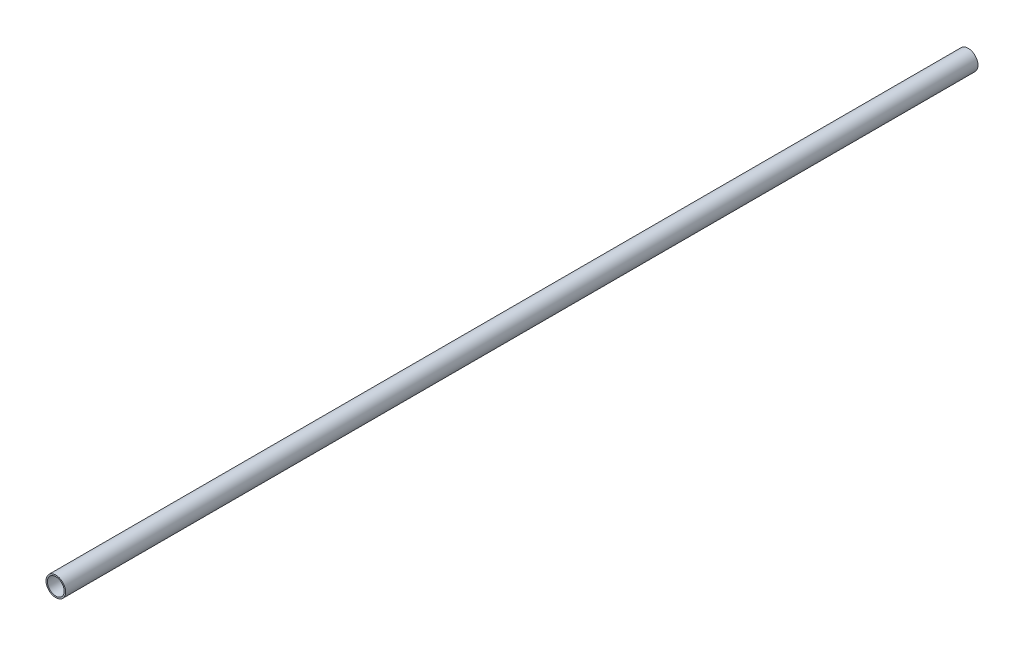
ISO-10303-21;
HEADER;
FILE_DESCRIPTION(('STEP AP214'),'2;1');
FILE_NAME('part.step','',(''),(''),'','','');
FILE_SCHEMA(('AUTOMOTIVE_DESIGN { 1 0 10303 214 1 1 1 1 }'));
ENDSEC;
DATA;
#1=APPLICATION_CONTEXT('core data for automotive mechanical design processes');
#2=APPLICATION_PROTOCOL_DEFINITION('international standard','automotive_design',2000,#1);
#3=PRODUCT_CONTEXT('',#1,'mechanical');
#4=PRODUCT('Part','Part','',(#3));
#5=PRODUCT_RELATED_PRODUCT_CATEGORY('part','',(#4));
#6=PRODUCT_DEFINITION_FORMATION('','',#4);
#7=PRODUCT_DEFINITION_CONTEXT('part definition',#1,'design');
#8=PRODUCT_DEFINITION('design','',#6,#7);
#9=PRODUCT_DEFINITION_SHAPE('','',#8);
#10=(LENGTH_UNIT() NAMED_UNIT(*) SI_UNIT(.MILLI.,.METRE.));
#11=(NAMED_UNIT(*) PLANE_ANGLE_UNIT() SI_UNIT($,.RADIAN.));
#12=(NAMED_UNIT(*) SI_UNIT($,.STERADIAN.) SOLID_ANGLE_UNIT());
#13=UNCERTAINTY_MEASURE_WITH_UNIT(LENGTH_MEASURE(1.E-05),#10,'distance_accuracy_value','');
#14=(GEOMETRIC_REPRESENTATION_CONTEXT(3) GLOBAL_UNCERTAINTY_ASSIGNED_CONTEXT((#13)) GLOBAL_UNIT_ASSIGNED_CONTEXT((#10,
#11,#12)) REPRESENTATION_CONTEXT('',''));
#15=CARTESIAN_POINT('',(0.,0.,0.));
#16=DIRECTION('',(0.,0.,1.));
#17=DIRECTION('',(1.,0.,0.));
#18=AXIS2_PLACEMENT_3D('',#15,#16,#17);
#19=CARTESIAN_POINT('',(0.,0.,325.));
#20=DIRECTION('',(0.,0.,1.));
#21=DIRECTION('',(1.,0.,0.));
#22=AXIS2_PLACEMENT_3D('',#19,#20,#21);
#23=PLANE('',#22);
#24=CARTESIAN_POINT('',(0.,0.,325.));
#25=DIRECTION('',(0.,0.,1.));
#26=DIRECTION('',(1.,0.,0.));
#27=AXIS2_PLACEMENT_3D('',#24,#25,#26);
#28=CIRCLE('',#27,7.);
#29=CARTESIAN_POINT('',(7.,0.,325.));
#30=VERTEX_POINT('',#29);
#31=EDGE_CURVE('E10',#30,#30,#28,.T.);
#32=ORIENTED_EDGE('',*,*,#31,.T.);
#33=EDGE_LOOP('',(#32));
#34=FACE_BOUND('',#33,.T.);
#35=CARTESIAN_POINT('',(0.,0.,325.));
#36=DIRECTION('',(0.,0.,1.));
#37=DIRECTION('',(1.,0.,0.));
#38=AXIS2_PLACEMENT_3D('',#35,#36,#37);
#39=CIRCLE('',#38,6.);
#40=CARTESIAN_POINT('',(6.,0.,325.));
#41=VERTEX_POINT('',#40);
#42=EDGE_CURVE('E50',#41,#41,#39,.T.);
#43=ORIENTED_EDGE('',*,*,#42,.F.);
#44=EDGE_LOOP('',(#43));
#45=FACE_BOUND('',#44,.T.);
#46=ADVANCED_FACE('F37',(#34,#45),#23,.T.);
#47=CARTESIAN_POINT('',(0.,0.,-325.));
#48=DIRECTION('',(0.,0.,1.));
#49=DIRECTION('',(1.,0.,0.));
#50=AXIS2_PLACEMENT_3D('',#47,#48,#49);
#51=PLANE('',#50);
#52=CARTESIAN_POINT('',(0.,0.,-325.));
#53=DIRECTION('',(0.,0.,1.));
#54=DIRECTION('',(1.,0.,0.));
#55=AXIS2_PLACEMENT_3D('',#52,#53,#54);
#56=CIRCLE('',#55,7.);
#57=CARTESIAN_POINT('',(7.,0.,-325.));
#58=VERTEX_POINT('',#57);
#59=EDGE_CURVE('E41',#58,#58,#56,.T.);
#60=ORIENTED_EDGE('',*,*,#59,.F.);
#61=EDGE_LOOP('',(#60));
#62=FACE_BOUND('',#61,.T.);
#63=CARTESIAN_POINT('',(0.,0.,-325.));
#64=DIRECTION('',(0.,0.,1.));
#65=DIRECTION('',(1.,0.,0.));
#66=AXIS2_PLACEMENT_3D('',#63,#64,#65);
#67=CIRCLE('',#66,6.);
#68=CARTESIAN_POINT('',(6.,0.,-325.));
#69=VERTEX_POINT('',#68);
#70=EDGE_CURVE('E52',#69,#69,#67,.T.);
#71=ORIENTED_EDGE('',*,*,#70,.T.);
#72=EDGE_LOOP('',(#71));
#73=FACE_BOUND('',#72,.T.);
#74=ADVANCED_FACE('F64',(#62,#73),#51,.F.);
#75=CARTESIAN_POINT('',(0.,0.,325.));
#76=DIRECTION('',(0.,0.,-1.));
#77=DIRECTION('',(-1.,0.,0.));
#78=AXIS2_PLACEMENT_3D('',#75,#76,#77);
#79=CYLINDRICAL_SURFACE('',#78,7.);
#80=ORIENTED_EDGE('',*,*,#31,.F.);
#81=EDGE_LOOP('',(#80));
#82=FACE_BOUND('',#81,.T.);
#83=ORIENTED_EDGE('',*,*,#59,.T.);
#84=EDGE_LOOP('',(#83));
#85=FACE_BOUND('',#84,.T.);
#86=ADVANCED_FACE('F39',(#82,#85),#79,.T.);
#87=CARTESIAN_POINT('',(0.,0.,325.));
#88=DIRECTION('',(0.,0.,-1.));
#89=DIRECTION('',(-1.,0.,0.));
#90=AXIS2_PLACEMENT_3D('',#87,#88,#89);
#91=CYLINDRICAL_SURFACE('',#90,6.);
#92=ORIENTED_EDGE('',*,*,#42,.T.);
#93=EDGE_LOOP('',(#92));
#94=FACE_BOUND('',#93,.T.);
#95=ORIENTED_EDGE('',*,*,#70,.F.);
#96=EDGE_LOOP('',(#95));
#97=FACE_BOUND('',#96,.T.);
#98=ADVANCED_FACE('F60',(#94,#97),#91,.F.);
#99=CLOSED_SHELL('',(#46,#74,#86,#98));
#100=MANIFOLD_SOLID_BREP('B2',#99);
#101=ADVANCED_BREP_SHAPE_REPRESENTATION('',(#18,#100),#14);
#102=SHAPE_DEFINITION_REPRESENTATION(#9,#101);
ENDSEC;
END-ISO-10303-21;
